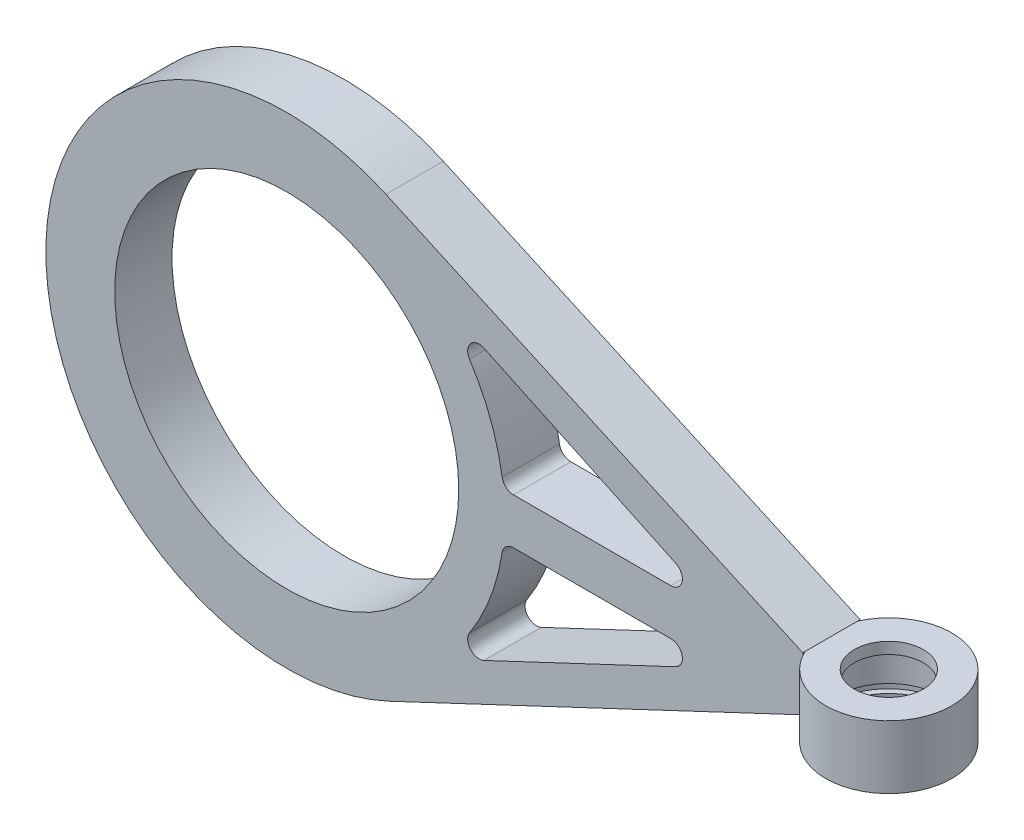
ISO-10303-21;
HEADER;
FILE_DESCRIPTION(('STEP AP214'),'2;1');
FILE_NAME('part.step','',(''),(''),'','','');
FILE_SCHEMA(('AUTOMOTIVE_DESIGN { 1 0 10303 214 1 1 1 1 }'));
ENDSEC;
DATA;
#1=APPLICATION_CONTEXT('core data for automotive mechanical design processes');
#2=APPLICATION_PROTOCOL_DEFINITION('international standard','automotive_design',2000,#1);
#3=PRODUCT_CONTEXT('',#1,'mechanical');
#4=PRODUCT('Part','Part','',(#3));
#5=PRODUCT_RELATED_PRODUCT_CATEGORY('part','',(#4));
#6=PRODUCT_DEFINITION_FORMATION('','',#4);
#7=PRODUCT_DEFINITION_CONTEXT('part definition',#1,'design');
#8=PRODUCT_DEFINITION('design','',#6,#7);
#9=PRODUCT_DEFINITION_SHAPE('','',#8);
#10=(LENGTH_UNIT() NAMED_UNIT(*) SI_UNIT(.MILLI.,.METRE.));
#11=(NAMED_UNIT(*) PLANE_ANGLE_UNIT() SI_UNIT($,.RADIAN.));
#12=(NAMED_UNIT(*) SI_UNIT($,.STERADIAN.) SOLID_ANGLE_UNIT());
#13=UNCERTAINTY_MEASURE_WITH_UNIT(LENGTH_MEASURE(1.E-05),#10,'distance_accuracy_value','');
#14=(GEOMETRIC_REPRESENTATION_CONTEXT(3) GLOBAL_UNCERTAINTY_ASSIGNED_CONTEXT((#13)) GLOBAL_UNIT_ASSIGNED_CONTEXT((#10,
#11,#12)) REPRESENTATION_CONTEXT('',''));
#15=CARTESIAN_POINT('',(0.,0.,0.));
#16=DIRECTION('',(0.,0.,1.));
#17=DIRECTION('',(1.,0.,0.));
#18=AXIS2_PLACEMENT_3D('',#15,#16,#17);
#19=CARTESIAN_POINT('',(100.,30.8308441227157,5.));
#20=DIRECTION('',(0.,-1.,0.));
#21=DIRECTION('',(0.,0.,-1.));
#22=AXIS2_PLACEMENT_3D('',#19,#20,#21);
#23=CYLINDRICAL_SURFACE('',#22,9.);
#24=CARTESIAN_POINT('',(100.,3.375,5.));
#25=DIRECTION('',(0.,1.,0.));
#26=DIRECTION('',(0.,0.,1.));
#27=AXIS2_PLACEMENT_3D('',#24,#25,#26);
#28=CIRCLE('',#27,9.);
#29=CARTESIAN_POINT('',(100.,3.375,14.));
#30=VERTEX_POINT('',#29);
#31=EDGE_CURVE('E211',#30,#30,#28,.F.);
#32=ORIENTED_EDGE('',*,*,#31,.F.);
#33=EDGE_LOOP('',(#32));
#34=FACE_BOUND('',#33,.T.);
#35=CARTESIAN_POINT('',(100.,-3.125,5.));
#36=DIRECTION('',(0.,-1.,0.));
#37=DIRECTION('',(0.,0.,-1.));
#38=AXIS2_PLACEMENT_3D('',#35,#36,#37);
#39=CIRCLE('',#38,9.);
#40=CARTESIAN_POINT('',(100.,-3.125,-4.));
#41=VERTEX_POINT('',#40);
#42=EDGE_CURVE('E302',#41,#41,#39,.T.);
#43=ORIENTED_EDGE('',*,*,#42,.T.);
#44=EDGE_LOOP('',(#43));
#45=FACE_BOUND('',#44,.T.);
#46=ADVANCED_FACE('F41',(#34,#45),#23,.F.);
#47=CARTESIAN_POINT('',(90.,5.375,10.));
#48=DIRECTION('',(-1.,0.,0.));
#49=DIRECTION('',(0.,0.,1.));
#50=AXIS2_PLACEMENT_3D('',#47,#48,#49);
#51=PLANE('',#50);
#52=DIRECTION('',(0.,0.,-1.));
#53=VECTOR('',#52,1.);
#54=CARTESIAN_POINT('',(90.,-4.,10.));
#55=LINE('',#54,#53);
#56=CARTESIAN_POINT('',(90.,-4.,10.));
#57=VERTEX_POINT('',#56);
#58=CARTESIAN_POINT('',(90.,-4.,9.58257569495581));
#59=VERTEX_POINT('',#58);
#60=EDGE_CURVE('E341',#57,#59,#55,.T.);
#61=ORIENTED_EDGE('',*,*,#60,.T.);
#62=DIRECTION('',(0.,1.,0.));
#63=VECTOR('',#62,1.);
#64=CARTESIAN_POINT('',(90.,22.7172907254556,9.58257569495581));
#65=LINE('',#64,#63);
#66=CARTESIAN_POINT('',(90.,5.375,9.58257569495578));
#67=VERTEX_POINT('',#66);
#68=EDGE_CURVE('E177',#59,#67,#65,.T.);
#69=ORIENTED_EDGE('',*,*,#68,.T.);
#70=DIRECTION('',(0.,0.,-1.));
#71=VECTOR('',#70,1.);
#72=CARTESIAN_POINT('',(90.,5.375,10.));
#73=LINE('',#72,#71);
#74=CARTESIAN_POINT('',(90.,5.375,10.));
#75=VERTEX_POINT('',#74);
#76=EDGE_CURVE('E195',#75,#67,#73,.T.);
#77=ORIENTED_EDGE('',*,*,#76,.F.);
#78=DIRECTION('',(0.,1.,0.));
#79=VECTOR('',#78,1.);
#80=CARTESIAN_POINT('',(90.,5.375,10.));
#81=LINE('',#80,#79);
#82=EDGE_CURVE('E324',#57,#75,#81,.T.);
#83=ORIENTED_EDGE('',*,*,#82,.F.);
#84=EDGE_LOOP('',(#61,#69,#77,#83));
#85=FACE_BOUND('',#84,.T.);
#86=ADVANCED_FACE('F357',(#85),#51,.F.);
#87=CARTESIAN_POINT('',(0.,0.,5.));
#88=DIRECTION('',(0.,0.,-1.));
#89=DIRECTION('',(-1.,0.,0.));
#90=AXIS2_PLACEMENT_3D('',#87,#88,#89);
#91=CYLINDRICAL_SURFACE('',#90,42.);
#92=CARTESIAN_POINT('',(0.,0.,0.));
#93=DIRECTION('',(0.,0.,1.));
#94=DIRECTION('',(1.,0.,0.));
#95=AXIS2_PLACEMENT_3D('',#92,#93,#94);
#96=CIRCLE('',#95,42.);
#97=CARTESIAN_POINT('',(17.3147372442319,38.2648647477449,0.));
#98=VERTEX_POINT('',#97);
#99=CARTESIAN_POINT('',(17.9115937476645,-37.9891406775493,0.));
#100=VERTEX_POINT('',#99);
#101=EDGE_CURVE('E199',#98,#100,#96,.T.);
#102=ORIENTED_EDGE('',*,*,#101,.T.);
#103=DIRECTION('',(0.,0.,-1.));
#104=VECTOR('',#103,1.);
#105=CARTESIAN_POINT('',(17.9115937476645,-37.9891406775493,10.));
#106=LINE('',#105,#104);
#107=CARTESIAN_POINT('',(17.9115937476645,-37.9891406775493,10.));
#108=VERTEX_POINT('',#107);
#109=EDGE_CURVE('E343',#108,#100,#106,.T.);
#110=ORIENTED_EDGE('',*,*,#109,.F.);
#111=CARTESIAN_POINT('',(0.,0.,10.));
#112=DIRECTION('',(0.,0.,1.));
#113=DIRECTION('',(1.,0.,0.));
#114=AXIS2_PLACEMENT_3D('',#111,#112,#113);
#115=CIRCLE('',#114,42.);
#116=CARTESIAN_POINT('',(17.3147372442319,38.2648647477449,10.));
#117=VERTEX_POINT('',#116);
#118=EDGE_CURVE('E331',#117,#108,#115,.T.);
#119=ORIENTED_EDGE('',*,*,#118,.F.);
#120=DIRECTION('',(0.,0.,-1.));
#121=VECTOR('',#120,1.);
#122=CARTESIAN_POINT('',(17.3147372442319,38.2648647477449,10.));
#123=LINE('',#122,#121);
#124=EDGE_CURVE('E193',#117,#98,#123,.T.);
#125=ORIENTED_EDGE('',*,*,#124,.T.);
#126=EDGE_LOOP('',(#102,#110,#119,#125));
#127=FACE_BOUND('',#126,.T.);
#128=ADVANCED_FACE('F350',(#127),#91,.T.);
#129=CARTESIAN_POINT('',(0.,0.,0.));
#130=DIRECTION('',(0.,0.,1.));
#131=DIRECTION('',(1.,0.,0.));
#132=AXIS2_PLACEMENT_3D('',#129,#130,#131);
#133=PLANE('',#132);
#134=DIRECTION('',(1.,0.,0.));
#135=VECTOR('',#134,1.);
#136=CARTESIAN_POINT('',(0.,4.,0.));
#137=LINE('',#136,#135);
#138=CARTESIAN_POINT('',(39.5474398665704,4.,0.));
#139=VERTEX_POINT('',#138);
#140=CARTESIAN_POINT('',(66.9993509701605,4.,0.));
#141=VERTEX_POINT('',#140);
#142=EDGE_CURVE('E293',#139,#141,#137,.T.);
#143=ORIENTED_EDGE('',*,*,#142,.T.);
#144=CARTESIAN_POINT('',(66.9993509701605,6.,0.));
#145=DIRECTION('',(0.,0.,1.));
#146=DIRECTION('',(1.,0.,0.));
#147=AXIS2_PLACEMENT_3D('',#144,#145,#146);
#148=CIRCLE('',#147,2.);
#149=CARTESIAN_POINT('',(67.8522840057636,7.80900669893091,0.));
#150=VERTEX_POINT('',#149);
#151=EDGE_CURVE('E250',#141,#150,#148,.T.);
#152=ORIENTED_EDGE('',*,*,#151,.T.);
#153=DIRECTION('',(-0.904503349465458,0.426466517801535,0.));
#154=VECTOR('',#153,1.);
#155=CARTESIAN_POINT('',(15.3527946408553,32.5621205807565,0.));
#156=LINE('',#155,#154);
#157=CARTESIAN_POINT('',(34.4118628573825,23.5759134432729,0.));
#158=VERTEX_POINT('',#157);
#159=EDGE_CURVE('E296',#150,#158,#156,.T.);
#160=ORIENTED_EDGE('',*,*,#159,.T.);
#161=CARTESIAN_POINT('',(33.5589298217795,21.766906744342,0.));
#162=DIRECTION('',(0.,0.,1.));
#163=DIRECTION('',(1.,0.,0.));
#164=AXIS2_PLACEMENT_3D('',#161,#162,#163);
#165=CIRCLE('',#164,2.);
#166=CARTESIAN_POINT('',(31.8809833306905,20.6785614071249,0.));
#167=VERTEX_POINT('',#166);
#168=EDGE_CURVE('E246',#158,#167,#165,.T.);
#169=ORIENTED_EDGE('',*,*,#168,.T.);
#170=CARTESIAN_POINT('',(0.,0.,0.));
#171=DIRECTION('',(0.,0.,1.));
#172=DIRECTION('',(1.,0.,0.));
#173=AXIS2_PLACEMENT_3D('',#170,#171,#172);
#174=CIRCLE('',#173,38.);
#175=CARTESIAN_POINT('',(37.5700678732419,5.7,0.));
#176=VERTEX_POINT('',#175);
#177=EDGE_CURVE('E299',#167,#176,#174,.F.);
#178=ORIENTED_EDGE('',*,*,#177,.T.);
#179=CARTESIAN_POINT('',(39.5474398665704,6.,0.));
#180=DIRECTION('',(0.,0.,1.));
#181=DIRECTION('',(1.,0.,0.));
#182=AXIS2_PLACEMENT_3D('',#179,#180,#181);
#183=CIRCLE('',#182,2.);
#184=EDGE_CURVE('E242',#176,#139,#183,.T.);
#185=ORIENTED_EDGE('',*,*,#184,.T.);
#186=EDGE_LOOP('',(#143,#152,#160,#169,#178,#185));
#187=FACE_BOUND('',#186,.T.);
#188=DIRECTION('',(0.904503349465458,0.426466517801535,0.));
#189=VECTOR('',#188,1.);
#190=CARTESIAN_POINT('',(15.3527946408553,-32.5621205807565,0.));
#191=LINE('',#190,#189);
#192=CARTESIAN_POINT('',(34.4118628573825,-23.5759134432729,0.));
#193=VERTEX_POINT('',#192);
#194=CARTESIAN_POINT('',(67.8522840057636,-7.80900669893091,0.));
#195=VERTEX_POINT('',#194);
#196=EDGE_CURVE('E277',#193,#195,#191,.T.);
#197=ORIENTED_EDGE('',*,*,#196,.T.);
#198=CARTESIAN_POINT('',(66.9993509701605,-6.,0.));
#199=DIRECTION('',(0.,0.,1.));
#200=DIRECTION('',(1.,0.,0.));
#201=AXIS2_PLACEMENT_3D('',#198,#199,#200);
#202=CIRCLE('',#201,2.);
#203=CARTESIAN_POINT('',(66.9993509701605,-4.,0.));
#204=VERTEX_POINT('',#203);
#205=EDGE_CURVE('E254',#195,#204,#202,.T.);
#206=ORIENTED_EDGE('',*,*,#205,.T.);
#207=DIRECTION('',(-1.,0.,0.));
#208=VECTOR('',#207,1.);
#209=CARTESIAN_POINT('',(0.,-4.,0.));
#210=LINE('',#209,#208);
#211=CARTESIAN_POINT('',(39.5474398665704,-4.,0.));
#212=VERTEX_POINT('',#211);
#213=EDGE_CURVE('E283',#204,#212,#210,.T.);
#214=ORIENTED_EDGE('',*,*,#213,.T.);
#215=CARTESIAN_POINT('',(39.5474398665704,-6.,0.));
#216=DIRECTION('',(0.,0.,1.));
#217=DIRECTION('',(1.,0.,0.));
#218=AXIS2_PLACEMENT_3D('',#215,#216,#217);
#219=CIRCLE('',#218,2.);
#220=CARTESIAN_POINT('',(37.5700678732419,-5.7,0.));
#221=VERTEX_POINT('',#220);
#222=EDGE_CURVE('E63',#212,#221,#219,.T.);
#223=ORIENTED_EDGE('',*,*,#222,.T.);
#224=CARTESIAN_POINT('',(0.,0.,0.));
#225=DIRECTION('',(0.,0.,1.));
#226=DIRECTION('',(1.,0.,0.));
#227=AXIS2_PLACEMENT_3D('',#224,#225,#226);
#228=CIRCLE('',#227,38.);
#229=CARTESIAN_POINT('',(31.8809833306905,-20.6785614071249,0.));
#230=VERTEX_POINT('',#229);
#231=EDGE_CURVE('E279',#221,#230,#228,.F.);
#232=ORIENTED_EDGE('',*,*,#231,.T.);
#233=CARTESIAN_POINT('',(33.5589298217795,-21.766906744342,0.));
#234=DIRECTION('',(0.,0.,1.));
#235=DIRECTION('',(1.,0.,0.));
#236=AXIS2_PLACEMENT_3D('',#233,#234,#235);
#237=CIRCLE('',#236,2.);
#238=EDGE_CURVE('E12',#230,#193,#237,.T.);
#239=ORIENTED_EDGE('',*,*,#238,.T.);
#240=EDGE_LOOP('',(#197,#206,#214,#223,#232,#239));
#241=FACE_BOUND('',#240,.T.);
#242=CARTESIAN_POINT('',(0.,0.,0.));
#243=DIRECTION('',(0.,0.,1.));
#244=DIRECTION('',(1.,0.,0.));
#245=AXIS2_PLACEMENT_3D('',#242,#243,#244);
#246=CIRCLE('',#245,30.);
#247=CARTESIAN_POINT('',(30.,0.,0.));
#248=VERTEX_POINT('',#247);
#249=EDGE_CURVE('E284',#248,#248,#246,.T.);
#250=ORIENTED_EDGE('',*,*,#249,.T.);
#251=EDGE_LOOP('',(#250));
#252=FACE_BOUND('',#251,.T.);
#253=ORIENTED_EDGE('',*,*,#101,.F.);
#254=DIRECTION('',(-0.91106820827964,0.412255648672188,0.));
#255=VECTOR('',#254,1.);
#256=CARTESIAN_POINT('',(17.3147372442319,38.2648647477449,0.));
#257=LINE('',#256,#255);
#258=CARTESIAN_POINT('',(90.,5.375,0.));
#259=VERTEX_POINT('',#258);
#260=EDGE_CURVE('E337',#259,#98,#257,.T.);
#261=ORIENTED_EDGE('',*,*,#260,.F.);
#262=DIRECTION('',(0.,1.,0.));
#263=VECTOR('',#262,1.);
#264=CARTESIAN_POINT('',(90.,5.375,0.));
#265=LINE('',#264,#263);
#266=CARTESIAN_POINT('',(90.,-4.,0.));
#267=VERTEX_POINT('',#266);
#268=EDGE_CURVE('E189',#267,#259,#265,.T.);
#269=ORIENTED_EDGE('',*,*,#268,.F.);
#270=DIRECTION('',(0.904503349465458,0.426466517801535,0.));
#271=VECTOR('',#270,1.);
#272=CARTESIAN_POINT('',(17.9115937476645,-37.9891406775493,0.));
#273=LINE('',#272,#271);
#274=EDGE_CURVE('E328',#100,#267,#273,.T.);
#275=ORIENTED_EDGE('',*,*,#274,.F.);
#276=EDGE_LOOP('',(#253,#261,#269,#275));
#277=FACE_BOUND('',#276,.T.);
#278=ADVANCED_FACE('F275',(#187,#241,#252,#277),#133,.F.);
#279=CARTESIAN_POINT('',(90.,5.375,0.41742430504422));
#280=VERTEX_POINT('',#279);
#281=EDGE_CURVE('E186',#280,#259,#73,.T.);
#282=ORIENTED_EDGE('',*,*,#281,.F.);
#283=DIRECTION('',(0.,1.,0.));
#284=VECTOR('',#283,1.);
#285=CARTESIAN_POINT('',(90.,22.7172907254556,0.41742430504419));
#286=LINE('',#285,#284);
#287=CARTESIAN_POINT('',(90.,-4.,0.417424305044189));
#288=VERTEX_POINT('',#287);
#289=EDGE_CURVE('E167',#280,#288,#286,.F.);
#290=ORIENTED_EDGE('',*,*,#289,.T.);
#291=EDGE_CURVE('E335',#288,#267,#55,.T.);
#292=ORIENTED_EDGE('',*,*,#291,.T.);
#293=ORIENTED_EDGE('',*,*,#268,.T.);
#294=EDGE_LOOP('',(#282,#290,#292,#293));
#295=FACE_BOUND('',#294,.T.);
#296=ADVANCED_FACE('F187',(#295),#51,.F.);
#297=CARTESIAN_POINT('',(17.3147372442319,38.2648647477449,10.));
#298=DIRECTION('',(-0.412255648672188,-0.91106820827964,0.));
#299=DIRECTION('',(0.91106820827964,-0.412255648672188,0.));
#300=AXIS2_PLACEMENT_3D('',#297,#298,#299);
#301=PLANE('',#300);
#302=ORIENTED_EDGE('',*,*,#260,.T.);
#303=ORIENTED_EDGE('',*,*,#124,.F.);
#304=DIRECTION('',(-0.91106820827964,0.412255648672188,0.));
#305=VECTOR('',#304,1.);
#306=CARTESIAN_POINT('',(17.3147372442319,38.2648647477449,10.));
#307=LINE('',#306,#305);
#308=EDGE_CURVE('E327',#75,#117,#307,.T.);
#309=ORIENTED_EDGE('',*,*,#308,.F.);
#310=ORIENTED_EDGE('',*,*,#76,.T.);
#311=EDGE_CURVE('E182',#67,#280,#73,.T.);
#312=ORIENTED_EDGE('',*,*,#311,.T.);
#313=ORIENTED_EDGE('',*,*,#281,.T.);
#314=EDGE_LOOP('',(#302,#303,#309,#310,#312,#313));
#315=FACE_BOUND('',#314,.T.);
#316=ADVANCED_FACE('F197',(#315),#301,.F.);
#317=CARTESIAN_POINT('',(17.9115937476645,-37.9891406775493,10.));
#318=DIRECTION('',(-0.426466517801535,0.904503349465458,0.));
#319=DIRECTION('',(-0.904503349465458,-0.426466517801535,0.));
#320=AXIS2_PLACEMENT_3D('',#317,#318,#319);
#321=PLANE('',#320);
#322=ORIENTED_EDGE('',*,*,#291,.F.);
#323=CARTESIAN_POINT('',(100.,0.714924693795416,5.));
#324=DIRECTION('',(-0.426466517801535,0.904503349465458,0.));
#325=DIRECTION('',(0.904503349465458,0.426466517801535,0.));
#326=AXIS2_PLACEMENT_3D('',#323,#324,#325);
#327=ELLIPSE('',#326,12.1613701115654,11.);
#328=EDGE_CURVE('E173',#288,#59,#327,.T.);
#329=ORIENTED_EDGE('',*,*,#328,.T.);
#330=ORIENTED_EDGE('',*,*,#60,.F.);
#331=DIRECTION('',(0.904503349465458,0.426466517801535,0.));
#332=VECTOR('',#331,1.);
#333=CARTESIAN_POINT('',(17.9115937476645,-37.9891406775493,10.));
#334=LINE('',#333,#332);
#335=EDGE_CURVE('E333',#108,#57,#334,.T.);
#336=ORIENTED_EDGE('',*,*,#335,.F.);
#337=ORIENTED_EDGE('',*,*,#109,.T.);
#338=ORIENTED_EDGE('',*,*,#274,.T.);
#339=EDGE_LOOP('',(#322,#329,#330,#336,#337,#338));
#340=FACE_BOUND('',#339,.T.);
#341=ADVANCED_FACE('F353',(#340),#321,.F.);
#342=CARTESIAN_POINT('',(0.,0.,10.));
#343=DIRECTION('',(0.,0.,1.));
#344=DIRECTION('',(1.,0.,0.));
#345=AXIS2_PLACEMENT_3D('',#342,#343,#344);
#346=PLANE('',#345);
#347=CARTESIAN_POINT('',(0.,0.,10.));
#348=DIRECTION('',(0.,0.,-1.));
#349=DIRECTION('',(-1.,0.,0.));
#350=AXIS2_PLACEMENT_3D('',#347,#348,#349);
#351=CIRCLE('',#350,38.);
#352=CARTESIAN_POINT('',(31.8809833306905,20.6785614071249,10.));
#353=VERTEX_POINT('',#352);
#354=CARTESIAN_POINT('',(37.5700678732419,5.7,10.));
#355=VERTEX_POINT('',#354);
#356=EDGE_CURVE('E660',#353,#355,#351,.T.);
#357=ORIENTED_EDGE('',*,*,#356,.F.);
#358=CARTESIAN_POINT('',(33.5589298217795,21.766906744342,10.));
#359=DIRECTION('',(0.,0.,1.));
#360=DIRECTION('',(1.,0.,0.));
#361=AXIS2_PLACEMENT_3D('',#358,#359,#360);
#362=CIRCLE('',#361,2.);
#363=CARTESIAN_POINT('',(34.4118628573825,23.5759134432729,10.));
#364=VERTEX_POINT('',#363);
#365=EDGE_CURVE('E244',#353,#364,#362,.F.);
#366=ORIENTED_EDGE('',*,*,#365,.T.);
#367=DIRECTION('',(-0.904503349465458,0.426466517801535,0.));
#368=VECTOR('',#367,1.);
#369=CARTESIAN_POINT('',(26.3565528061707,27.3739314709366,10.));
#370=LINE('',#369,#368);
#371=CARTESIAN_POINT('',(67.8522840057635,7.80900669893092,10.));
#372=VERTEX_POINT('',#371);
#373=EDGE_CURVE('E270',#372,#364,#370,.T.);
#374=ORIENTED_EDGE('',*,*,#373,.F.);
#375=CARTESIAN_POINT('',(66.9993509701605,6.,10.));
#376=DIRECTION('',(0.,0.,1.));
#377=DIRECTION('',(1.,0.,0.));
#378=AXIS2_PLACEMENT_3D('',#375,#376,#377);
#379=CIRCLE('',#378,2.);
#380=CARTESIAN_POINT('',(66.9993509701605,4.,10.));
#381=VERTEX_POINT('',#380);
#382=EDGE_CURVE('E248',#372,#381,#379,.F.);
#383=ORIENTED_EDGE('',*,*,#382,.T.);
#384=DIRECTION('',(1.,0.,0.));
#385=VECTOR('',#384,1.);
#386=CARTESIAN_POINT('',(37.7888872553824,4.,10.));
#387=LINE('',#386,#385);
#388=CARTESIAN_POINT('',(39.5474398665704,4.,10.));
#389=VERTEX_POINT('',#388);
#390=EDGE_CURVE('E663',#389,#381,#387,.T.);
#391=ORIENTED_EDGE('',*,*,#390,.F.);
#392=CARTESIAN_POINT('',(39.5474398665704,6.,10.));
#393=DIRECTION('',(0.,0.,1.));
#394=DIRECTION('',(1.,0.,0.));
#395=AXIS2_PLACEMENT_3D('',#392,#393,#394);
#396=CIRCLE('',#395,2.);
#397=EDGE_CURVE('E240',#389,#355,#396,.F.);
#398=ORIENTED_EDGE('',*,*,#397,.T.);
#399=EDGE_LOOP('',(#357,#366,#374,#383,#391,#398));
#400=FACE_BOUND('',#399,.T.);
#401=CARTESIAN_POINT('',(0.,0.,10.));
#402=DIRECTION('',(0.,0.,-1.));
#403=DIRECTION('',(1.,0.,0.));
#404=AXIS2_PLACEMENT_3D('',#401,#402,#403);
#405=CIRCLE('',#404,38.);
#406=CARTESIAN_POINT('',(37.5700678732419,-5.7,10.));
#407=VERTEX_POINT('',#406);
#408=CARTESIAN_POINT('',(31.8809833306905,-20.6785614071249,10.));
#409=VERTEX_POINT('',#408);
#410=EDGE_CURVE('E263',#407,#409,#405,.T.);
#411=ORIENTED_EDGE('',*,*,#410,.F.);
#412=CARTESIAN_POINT('',(39.5474398665704,-6.,10.));
#413=DIRECTION('',(0.,0.,1.));
#414=DIRECTION('',(1.,0.,0.));
#415=AXIS2_PLACEMENT_3D('',#412,#413,#414);
#416=CIRCLE('',#415,2.);
#417=CARTESIAN_POINT('',(39.5474398665704,-4.,10.));
#418=VERTEX_POINT('',#417);
#419=EDGE_CURVE('E256',#407,#418,#416,.F.);
#420=ORIENTED_EDGE('',*,*,#419,.T.);
#421=DIRECTION('',(-1.,0.,0.));
#422=VECTOR('',#421,1.);
#423=CARTESIAN_POINT('',(37.7888872553824,-4.,10.));
#424=LINE('',#423,#422);
#425=CARTESIAN_POINT('',(66.9993509701605,-4.,10.));
#426=VERTEX_POINT('',#425);
#427=EDGE_CURVE('E653',#426,#418,#424,.T.);
#428=ORIENTED_EDGE('',*,*,#427,.F.);
#429=CARTESIAN_POINT('',(66.9993509701605,-6.,10.));
#430=DIRECTION('',(0.,0.,1.));
#431=DIRECTION('',(1.,0.,0.));
#432=AXIS2_PLACEMENT_3D('',#429,#430,#431);
#433=CIRCLE('',#432,2.);
#434=CARTESIAN_POINT('',(67.8522840057635,-7.80900669893092,10.));
#435=VERTEX_POINT('',#434);
#436=EDGE_CURVE('E252',#426,#435,#433,.F.);
#437=ORIENTED_EDGE('',*,*,#436,.T.);
#438=DIRECTION('',(0.904503349465458,0.426466517801535,0.));
#439=VECTOR('',#438,1.);
#440=CARTESIAN_POINT('',(26.3565528061707,-27.3739314709366,10.));
#441=LINE('',#440,#439);
#442=CARTESIAN_POINT('',(34.4118628573825,-23.5759134432729,10.));
#443=VERTEX_POINT('',#442);
#444=EDGE_CURVE('E265',#443,#435,#441,.T.);
#445=ORIENTED_EDGE('',*,*,#444,.F.);
#446=CARTESIAN_POINT('',(33.5589298217795,-21.766906744342,10.));
#447=DIRECTION('',(0.,0.,1.));
#448=DIRECTION('',(1.,0.,0.));
#449=AXIS2_PLACEMENT_3D('',#446,#447,#448);
#450=CIRCLE('',#449,2.);
#451=EDGE_CURVE('E49',#443,#409,#450,.F.);
#452=ORIENTED_EDGE('',*,*,#451,.T.);
#453=EDGE_LOOP('',(#411,#420,#428,#437,#445,#452));
#454=FACE_BOUND('',#453,.T.);
#455=CARTESIAN_POINT('',(0.,0.,10.));
#456=DIRECTION('',(0.,0.,1.));
#457=DIRECTION('',(1.,0.,0.));
#458=AXIS2_PLACEMENT_3D('',#455,#456,#457);
#459=CIRCLE('',#458,30.);
#460=CARTESIAN_POINT('',(30.,0.,10.));
#461=VERTEX_POINT('',#460);
#462=EDGE_CURVE('E288',#461,#461,#459,.T.);
#463=ORIENTED_EDGE('',*,*,#462,.F.);
#464=EDGE_LOOP('',(#463));
#465=FACE_BOUND('',#464,.T.);
#466=ORIENTED_EDGE('',*,*,#82,.T.);
#467=ORIENTED_EDGE('',*,*,#308,.T.);
#468=ORIENTED_EDGE('',*,*,#118,.T.);
#469=ORIENTED_EDGE('',*,*,#335,.T.);
#470=EDGE_LOOP('',(#466,#467,#468,#469));
#471=FACE_BOUND('',#470,.T.);
#472=ADVANCED_FACE('F261',(#400,#454,#465,#471),#346,.T.);
#473=CARTESIAN_POINT('',(89.,5.375,5.));
#474=DIRECTION('',(0.,1.,0.));
#475=DIRECTION('',(0.,0.,1.));
#476=AXIS2_PLACEMENT_3D('',#473,#474,#475);
#477=PLANE('',#476);
#478=CARTESIAN_POINT('',(100.,5.375,5.));
#479=DIRECTION('',(0.,1.,0.));
#480=DIRECTION('',(0.,0.,1.));
#481=AXIS2_PLACEMENT_3D('',#478,#479,#480);
#482=CIRCLE('',#481,6.);
#483=CARTESIAN_POINT('',(100.,5.375,11.));
#484=VERTEX_POINT('',#483);
#485=EDGE_CURVE('E210',#484,#484,#482,.T.);
#486=ORIENTED_EDGE('',*,*,#485,.F.);
#487=EDGE_LOOP('',(#486));
#488=FACE_BOUND('',#487,.T.);
#489=ORIENTED_EDGE('',*,*,#311,.F.);
#490=CARTESIAN_POINT('',(100.,5.375,5.));
#491=DIRECTION('',(0.,1.,0.));
#492=DIRECTION('',(0.,0.,1.));
#493=AXIS2_PLACEMENT_3D('',#490,#491,#492);
#494=CIRCLE('',#493,11.);
#495=EDGE_CURVE('E170',#67,#280,#494,.T.);
#496=ORIENTED_EDGE('',*,*,#495,.T.);
#497=EDGE_LOOP('',(#489,#496));
#498=FACE_BOUND('',#497,.T.);
#499=ADVANCED_FACE('F180',(#488,#498),#477,.T.);
#500=CARTESIAN_POINT('',(100.,22.7172907254556,5.));
#501=DIRECTION('',(0.,1.,0.));
#502=DIRECTION('',(0.,0.,1.));
#503=AXIS2_PLACEMENT_3D('',#500,#501,#502);
#504=CYLINDRICAL_SURFACE('',#503,11.);
#505=CARTESIAN_POINT('',(100.,-5.625,5.));
#506=DIRECTION('',(0.,1.,0.));
#507=DIRECTION('',(0.,0.,1.));
#508=AXIS2_PLACEMENT_3D('',#505,#506,#507);
#509=CIRCLE('',#508,11.);
#510=CARTESIAN_POINT('',(100.,-5.625,16.));
#511=VERTEX_POINT('',#510);
#512=EDGE_CURVE('E183',#511,#511,#509,.T.);
#513=ORIENTED_EDGE('',*,*,#512,.T.);
#514=EDGE_LOOP('',(#513));
#515=FACE_BOUND('',#514,.T.);
#516=ORIENTED_EDGE('',*,*,#68,.F.);
#517=ORIENTED_EDGE('',*,*,#328,.F.);
#518=ORIENTED_EDGE('',*,*,#289,.F.);
#519=ORIENTED_EDGE('',*,*,#495,.F.);
#520=EDGE_LOOP('',(#516,#517,#518,#519));
#521=FACE_BOUND('',#520,.T.);
#522=ADVANCED_FACE('F169',(#515,#521),#504,.T.);
#523=CARTESIAN_POINT('',(89.,-5.625,5.));
#524=DIRECTION('',(0.,-1.,0.));
#525=DIRECTION('',(0.,0.,-1.));
#526=AXIS2_PLACEMENT_3D('',#523,#524,#525);
#527=PLANE('',#526);
#528=CARTESIAN_POINT('',(100.,-5.625,5.));
#529=DIRECTION('',(0.,-1.,0.));
#530=DIRECTION('',(0.,0.,-1.));
#531=AXIS2_PLACEMENT_3D('',#528,#529,#530);
#532=CIRCLE('',#531,9.);
#533=CARTESIAN_POINT('',(100.,-5.625,-4.));
#534=VERTEX_POINT('',#533);
#535=EDGE_CURVE('E310',#534,#534,#532,.T.);
#536=ORIENTED_EDGE('',*,*,#535,.F.);
#537=EDGE_LOOP('',(#536));
#538=FACE_BOUND('',#537,.T.);
#539=ORIENTED_EDGE('',*,*,#512,.F.);
#540=EDGE_LOOP('',(#539));
#541=FACE_BOUND('',#540,.T.);
#542=ADVANCED_FACE('F398',(#538,#541),#527,.T.);
#543=CARTESIAN_POINT('',(100.,19.375,5.));
#544=DIRECTION('',(0.,-1.,0.));
#545=DIRECTION('',(0.,0.,-1.));
#546=AXIS2_PLACEMENT_3D('',#543,#544,#545);
#547=CYLINDRICAL_SURFACE('',#546,6.);
#548=CARTESIAN_POINT('',(100.,3.375,5.));
#549=DIRECTION('',(0.,1.,0.));
#550=DIRECTION('',(0.,0.,1.));
#551=AXIS2_PLACEMENT_3D('',#548,#549,#550);
#552=CIRCLE('',#551,6.);
#553=CARTESIAN_POINT('',(100.,3.375,11.));
#554=VERTEX_POINT('',#553);
#555=EDGE_CURVE('E207',#554,#554,#552,.F.);
#556=ORIENTED_EDGE('',*,*,#555,.T.);
#557=EDGE_LOOP('',(#556));
#558=FACE_BOUND('',#557,.T.);
#559=ORIENTED_EDGE('',*,*,#485,.T.);
#560=EDGE_LOOP('',(#559));
#561=FACE_BOUND('',#560,.T.);
#562=ADVANCED_FACE('F392',(#558,#561),#547,.F.);
#563=CARTESIAN_POINT('',(89.,3.375,5.));
#564=DIRECTION('',(0.,1.,0.));
#565=DIRECTION('',(0.,0.,1.));
#566=AXIS2_PLACEMENT_3D('',#563,#564,#565);
#567=PLANE('',#566);
#568=ORIENTED_EDGE('',*,*,#31,.T.);
#569=EDGE_LOOP('',(#568));
#570=FACE_BOUND('',#569,.T.);
#571=ORIENTED_EDGE('',*,*,#555,.F.);
#572=EDGE_LOOP('',(#571));
#573=FACE_BOUND('',#572,.T.);
#574=ADVANCED_FACE('F384',(#570,#573),#567,.F.);
#575=CARTESIAN_POINT('',(100.,-4.625,5.));
#576=DIRECTION('',(0.,-1.,0.));
#577=DIRECTION('',(0.,0.,-1.));
#578=AXIS2_PLACEMENT_3D('',#575,#576,#577);
#579=CIRCLE('',#578,9.);
#580=CARTESIAN_POINT('',(100.,-4.625,-4.));
#581=VERTEX_POINT('',#580);
#582=EDGE_CURVE('E303',#581,#581,#579,.T.);
#583=ORIENTED_EDGE('',*,*,#582,.F.);
#584=EDGE_LOOP('',(#583));
#585=FACE_BOUND('',#584,.T.);
#586=ORIENTED_EDGE('',*,*,#535,.T.);
#587=EDGE_LOOP('',(#586));
#588=FACE_BOUND('',#587,.T.);
#589=ADVANCED_FACE('F373',(#585,#588),#23,.F.);
#590=CARTESIAN_POINT('',(100.,-4.625,5.));
#591=DIRECTION('',(0.,1.,0.));
#592=DIRECTION('',(0.,0.,1.));
#593=AXIS2_PLACEMENT_3D('',#590,#591,#592);
#594=CYLINDRICAL_SURFACE('',#593,9.99999999999999);
#595=CARTESIAN_POINT('',(100.,-4.625,5.));
#596=DIRECTION('',(0.,-1.,0.));
#597=DIRECTION('',(0.,0.,-1.));
#598=AXIS2_PLACEMENT_3D('',#595,#596,#597);
#599=CIRCLE('',#598,9.99999999999999);
#600=CARTESIAN_POINT('',(100.,-4.625,-4.99999999999999));
#601=VERTEX_POINT('',#600);
#602=EDGE_CURVE('E306',#601,#601,#599,.T.);
#603=ORIENTED_EDGE('',*,*,#602,.T.);
#604=EDGE_LOOP('',(#603));
#605=FACE_BOUND('',#604,.T.);
#606=CARTESIAN_POINT('',(100.,-3.125,5.));
#607=DIRECTION('',(0.,-1.,0.));
#608=DIRECTION('',(0.,0.,-1.));
#609=AXIS2_PLACEMENT_3D('',#606,#607,#608);
#610=CIRCLE('',#609,9.99999999999999);
#611=CARTESIAN_POINT('',(100.,-3.125,-4.99999999999999));
#612=VERTEX_POINT('',#611);
#613=EDGE_CURVE('E307',#612,#612,#610,.T.);
#614=ORIENTED_EDGE('',*,*,#613,.F.);
#615=EDGE_LOOP('',(#614));
#616=FACE_BOUND('',#615,.T.);
#617=ADVANCED_FACE('F383',(#605,#616),#594,.F.);
#618=CARTESIAN_POINT('',(0.,-4.625,0.));
#619=DIRECTION('',(0.,-1.,0.));
#620=DIRECTION('',(0.,0.,-1.));
#621=AXIS2_PLACEMENT_3D('',#618,#619,#620);
#622=PLANE('',#621);
#623=ORIENTED_EDGE('',*,*,#582,.T.);
#624=EDGE_LOOP('',(#623));
#625=FACE_BOUND('',#624,.T.);
#626=ORIENTED_EDGE('',*,*,#602,.F.);
#627=EDGE_LOOP('',(#626));
#628=FACE_BOUND('',#627,.T.);
#629=ADVANCED_FACE('F390',(#625,#628),#622,.F.);
#630=CARTESIAN_POINT('',(0.,-3.125,0.));
#631=DIRECTION('',(0.,-1.,0.));
#632=DIRECTION('',(0.,0.,-1.));
#633=AXIS2_PLACEMENT_3D('',#630,#631,#632);
#634=PLANE('',#633);
#635=ORIENTED_EDGE('',*,*,#42,.F.);
#636=EDGE_LOOP('',(#635));
#637=FACE_BOUND('',#636,.T.);
#638=ORIENTED_EDGE('',*,*,#613,.T.);
#639=EDGE_LOOP('',(#638));
#640=FACE_BOUND('',#639,.T.);
#641=ADVANCED_FACE('F446',(#637,#640),#634,.T.);
#642=CARTESIAN_POINT('',(0.,0.,-20.));
#643=DIRECTION('',(0.,0.,1.));
#644=DIRECTION('',(1.,0.,0.));
#645=AXIS2_PLACEMENT_3D('',#642,#643,#644);
#646=CYLINDRICAL_SURFACE('',#645,30.);
#647=ORIENTED_EDGE('',*,*,#462,.T.);
#648=EDGE_LOOP('',(#647));
#649=FACE_BOUND('',#648,.T.);
#650=ORIENTED_EDGE('',*,*,#249,.F.);
#651=EDGE_LOOP('',(#650));
#652=FACE_BOUND('',#651,.T.);
#653=ADVANCED_FACE('F456',(#649,#652),#646,.F.);
#654=CARTESIAN_POINT('',(0.,0.,-20.));
#655=DIRECTION('',(0.,0.,1.));
#656=DIRECTION('',(1.,0.,0.));
#657=AXIS2_PLACEMENT_3D('',#654,#655,#656);
#658=CYLINDRICAL_SURFACE('',#657,38.);
#659=ORIENTED_EDGE('',*,*,#231,.F.);
#660=DIRECTION('',(0.,0.,1.));
#661=VECTOR('',#660,1.);
#662=CARTESIAN_POINT('',(37.5700678732419,-5.7,-20.));
#663=LINE('',#662,#661);
#664=EDGE_CURVE('E237',#221,#407,#663,.T.);
#665=ORIENTED_EDGE('',*,*,#664,.T.);
#666=ORIENTED_EDGE('',*,*,#410,.T.);
#667=DIRECTION('',(0.,0.,1.));
#668=VECTOR('',#667,1.);
#669=CARTESIAN_POINT('',(31.8809833306905,-20.6785614071249,-20.));
#670=LINE('',#669,#668);
#671=EDGE_CURVE('E56',#409,#230,#670,.F.);
#672=ORIENTED_EDGE('',*,*,#671,.T.);
#673=EDGE_LOOP('',(#659,#665,#666,#672));
#674=FACE_BOUND('',#673,.T.);
#675=ADVANCED_FACE('F268',(#674),#658,.T.);
#676=CARTESIAN_POINT('',(37.7888872553824,-4.,-20.));
#677=DIRECTION('',(0.,1.,0.));
#678=DIRECTION('',(0.,0.,1.));
#679=AXIS2_PLACEMENT_3D('',#676,#677,#678);
#680=PLANE('',#679);
#681=ORIENTED_EDGE('',*,*,#213,.F.);
#682=DIRECTION('',(0.,0.,1.));
#683=VECTOR('',#682,1.);
#684=CARTESIAN_POINT('',(66.9993509701605,-4.,9.99999999999999));
#685=LINE('',#684,#683);
#686=EDGE_CURVE('E228',#204,#426,#685,.T.);
#687=ORIENTED_EDGE('',*,*,#686,.T.);
#688=ORIENTED_EDGE('',*,*,#427,.T.);
#689=DIRECTION('',(0.,0.,-1.));
#690=VECTOR('',#689,1.);
#691=CARTESIAN_POINT('',(39.5474398665704,-4.,0.));
#692=LINE('',#691,#690);
#693=EDGE_CURVE('E226',#418,#212,#692,.T.);
#694=ORIENTED_EDGE('',*,*,#693,.T.);
#695=EDGE_LOOP('',(#681,#687,#688,#694));
#696=FACE_BOUND('',#695,.T.);
#697=ADVANCED_FACE('F494',(#696),#680,.F.);
#698=CARTESIAN_POINT('',(26.3565528061707,-27.3739314709366,-20.));
#699=DIRECTION('',(0.426466517801535,-0.904503349465458,0.));
#700=DIRECTION('',(0.904503349465458,0.426466517801535,0.));
#701=AXIS2_PLACEMENT_3D('',#698,#699,#700);
#702=PLANE('',#701);
#703=ORIENTED_EDGE('',*,*,#444,.T.);
#704=DIRECTION('',(0.,0.,1.));
#705=VECTOR('',#704,1.);
#706=CARTESIAN_POINT('',(67.8522840057636,-7.80900669893092,0.));
#707=LINE('',#706,#705);
#708=EDGE_CURVE('E234',#435,#195,#707,.F.);
#709=ORIENTED_EDGE('',*,*,#708,.T.);
#710=ORIENTED_EDGE('',*,*,#196,.F.);
#711=DIRECTION('',(0.,0.,-1.));
#712=VECTOR('',#711,1.);
#713=CARTESIAN_POINT('',(34.4118628573825,-23.5759134432729,10.));
#714=LINE('',#713,#712);
#715=EDGE_CURVE('E231',#193,#443,#714,.F.);
#716=ORIENTED_EDGE('',*,*,#715,.T.);
#717=EDGE_LOOP('',(#703,#709,#710,#716));
#718=FACE_BOUND('',#717,.T.);
#719=ADVANCED_FACE('F281',(#718),#702,.F.);
#720=CARTESIAN_POINT('',(0.,0.,-20.));
#721=DIRECTION('',(0.,0.,1.));
#722=DIRECTION('',(1.,0.,0.));
#723=AXIS2_PLACEMENT_3D('',#720,#721,#722);
#724=CYLINDRICAL_SURFACE('',#723,38.);
#725=ORIENTED_EDGE('',*,*,#356,.T.);
#726=DIRECTION('',(0.,0.,1.));
#727=VECTOR('',#726,1.);
#728=CARTESIAN_POINT('',(37.5700678732419,5.7,-20.));
#729=LINE('',#728,#727);
#730=EDGE_CURVE('E219',#355,#176,#729,.F.);
#731=ORIENTED_EDGE('',*,*,#730,.T.);
#732=ORIENTED_EDGE('',*,*,#177,.F.);
#733=DIRECTION('',(0.,0.,1.));
#734=VECTOR('',#733,1.);
#735=CARTESIAN_POINT('',(31.8809833306905,20.6785614071249,-20.));
#736=LINE('',#735,#734);
#737=EDGE_CURVE('E216',#167,#353,#736,.T.);
#738=ORIENTED_EDGE('',*,*,#737,.T.);
#739=EDGE_LOOP('',(#725,#731,#732,#738));
#740=FACE_BOUND('',#739,.T.);
#741=ADVANCED_FACE('F512',(#740),#724,.T.);
#742=CARTESIAN_POINT('',(26.3565528061707,27.3739314709366,-20.));
#743=DIRECTION('',(0.426466517801535,0.904503349465458,0.));
#744=DIRECTION('',(-0.904503349465458,0.426466517801535,0.));
#745=AXIS2_PLACEMENT_3D('',#742,#743,#744);
#746=PLANE('',#745);
#747=ORIENTED_EDGE('',*,*,#373,.T.);
#748=DIRECTION('',(0.,0.,-1.));
#749=VECTOR('',#748,1.);
#750=CARTESIAN_POINT('',(34.4118628573825,23.5759134432729,0.));
#751=LINE('',#750,#749);
#752=EDGE_CURVE('E224',#364,#158,#751,.T.);
#753=ORIENTED_EDGE('',*,*,#752,.T.);
#754=ORIENTED_EDGE('',*,*,#159,.F.);
#755=DIRECTION('',(0.,0.,1.));
#756=VECTOR('',#755,1.);
#757=CARTESIAN_POINT('',(67.8522840057636,7.80900669893091,9.99999999999999));
#758=LINE('',#757,#756);
#759=EDGE_CURVE('E221',#150,#372,#758,.T.);
#760=ORIENTED_EDGE('',*,*,#759,.T.);
#761=EDGE_LOOP('',(#747,#753,#754,#760));
#762=FACE_BOUND('',#761,.T.);
#763=ADVANCED_FACE('F521',(#762),#746,.F.);
#764=CARTESIAN_POINT('',(37.7888872553824,4.,-20.));
#765=DIRECTION('',(0.,-1.,0.));
#766=DIRECTION('',(0.,0.,-1.));
#767=AXIS2_PLACEMENT_3D('',#764,#765,#766);
#768=PLANE('',#767);
#769=ORIENTED_EDGE('',*,*,#142,.F.);
#770=DIRECTION('',(0.,0.,-1.));
#771=VECTOR('',#770,1.);
#772=CARTESIAN_POINT('',(39.5474398665704,4.,10.));
#773=LINE('',#772,#771);
#774=EDGE_CURVE('E213',#139,#389,#773,.F.);
#775=ORIENTED_EDGE('',*,*,#774,.T.);
#776=ORIENTED_EDGE('',*,*,#390,.T.);
#777=DIRECTION('',(0.,0.,1.));
#778=VECTOR('',#777,1.);
#779=CARTESIAN_POINT('',(66.9993509701605,4.,0.));
#780=LINE('',#779,#778);
#781=EDGE_CURVE('E206',#381,#141,#780,.F.);
#782=ORIENTED_EDGE('',*,*,#781,.T.);
#783=EDGE_LOOP('',(#769,#775,#776,#782));
#784=FACE_BOUND('',#783,.T.);
#785=ADVANCED_FACE('F531',(#784),#768,.F.);
#786=CARTESIAN_POINT('',(39.5474398665704,6.,-20.));
#787=DIRECTION('',(0.,0.,1.));
#788=DIRECTION('',(1.,0.,0.));
#789=AXIS2_PLACEMENT_3D('',#786,#787,#788);
#790=CYLINDRICAL_SURFACE('',#789,2.);
#791=ORIENTED_EDGE('',*,*,#184,.F.);
#792=ORIENTED_EDGE('',*,*,#730,.F.);
#793=ORIENTED_EDGE('',*,*,#397,.F.);
#794=ORIENTED_EDGE('',*,*,#774,.F.);
#795=EDGE_LOOP('',(#791,#792,#793,#794));
#796=FACE_BOUND('',#795,.T.);
#797=ADVANCED_FACE('F541',(#796),#790,.F.);
#798=CARTESIAN_POINT('',(33.5589298217795,21.766906744342,-20.));
#799=DIRECTION('',(0.,0.,1.));
#800=DIRECTION('',(1.,0.,0.));
#801=AXIS2_PLACEMENT_3D('',#798,#799,#800);
#802=CYLINDRICAL_SURFACE('',#801,2.);
#803=ORIENTED_EDGE('',*,*,#168,.F.);
#804=ORIENTED_EDGE('',*,*,#752,.F.);
#805=ORIENTED_EDGE('',*,*,#365,.F.);
#806=ORIENTED_EDGE('',*,*,#737,.F.);
#807=EDGE_LOOP('',(#803,#804,#805,#806));
#808=FACE_BOUND('',#807,.T.);
#809=ADVANCED_FACE('F551',(#808),#802,.F.);
#810=CARTESIAN_POINT('',(66.9993509701605,6.,-20.));
#811=DIRECTION('',(0.,0.,-1.));
#812=DIRECTION('',(-1.,0.,0.));
#813=AXIS2_PLACEMENT_3D('',#810,#811,#812);
#814=CYLINDRICAL_SURFACE('',#813,2.);
#815=ORIENTED_EDGE('',*,*,#151,.F.);
#816=ORIENTED_EDGE('',*,*,#781,.F.);
#817=ORIENTED_EDGE('',*,*,#382,.F.);
#818=ORIENTED_EDGE('',*,*,#759,.F.);
#819=EDGE_LOOP('',(#815,#816,#817,#818));
#820=FACE_BOUND('',#819,.T.);
#821=ADVANCED_FACE('F561',(#820),#814,.F.);
#822=CARTESIAN_POINT('',(66.9993509701605,-6.,-20.));
#823=DIRECTION('',(0.,0.,-1.));
#824=DIRECTION('',(-1.,0.,0.));
#825=AXIS2_PLACEMENT_3D('',#822,#823,#824);
#826=CYLINDRICAL_SURFACE('',#825,2.);
#827=ORIENTED_EDGE('',*,*,#205,.F.);
#828=ORIENTED_EDGE('',*,*,#708,.F.);
#829=ORIENTED_EDGE('',*,*,#436,.F.);
#830=ORIENTED_EDGE('',*,*,#686,.F.);
#831=EDGE_LOOP('',(#827,#828,#829,#830));
#832=FACE_BOUND('',#831,.T.);
#833=ADVANCED_FACE('F571',(#832),#826,.F.);
#834=CARTESIAN_POINT('',(39.5474398665704,-6.,-20.));
#835=DIRECTION('',(0.,0.,1.));
#836=DIRECTION('',(1.,0.,0.));
#837=AXIS2_PLACEMENT_3D('',#834,#835,#836);
#838=CYLINDRICAL_SURFACE('',#837,2.);
#839=ORIENTED_EDGE('',*,*,#222,.F.);
#840=ORIENTED_EDGE('',*,*,#693,.F.);
#841=ORIENTED_EDGE('',*,*,#419,.F.);
#842=ORIENTED_EDGE('',*,*,#664,.F.);
#843=EDGE_LOOP('',(#839,#840,#841,#842));
#844=FACE_BOUND('',#843,.T.);
#845=ADVANCED_FACE('F581',(#844),#838,.F.);
#846=CARTESIAN_POINT('',(33.5589298217795,-21.766906744342,-20.));
#847=DIRECTION('',(0.,0.,1.));
#848=DIRECTION('',(1.,0.,0.));
#849=AXIS2_PLACEMENT_3D('',#846,#847,#848);
#850=CYLINDRICAL_SURFACE('',#849,2.);
#851=ORIENTED_EDGE('',*,*,#238,.F.);
#852=ORIENTED_EDGE('',*,*,#671,.F.);
#853=ORIENTED_EDGE('',*,*,#451,.F.);
#854=ORIENTED_EDGE('',*,*,#715,.F.);
#855=EDGE_LOOP('',(#851,#852,#853,#854));
#856=FACE_BOUND('',#855,.T.);
#857=ADVANCED_FACE('F43',(#856),#850,.F.);
#858=CLOSED_SHELL('',(#46,#86,#128,#278,#296,#316,#341,#472,#499,#522,#542,#562,#574,#589,#617,
#629,#641,#653,#675,#697,#719,#741,#763,#785,#797,#809,#821,#833,#845,#857));
#859=MANIFOLD_SOLID_BREP('B2',#858);
#860=ADVANCED_BREP_SHAPE_REPRESENTATION('',(#18,#859),#14);
#861=SHAPE_DEFINITION_REPRESENTATION(#9,#860);
ENDSEC;
END-ISO-10303-21;
